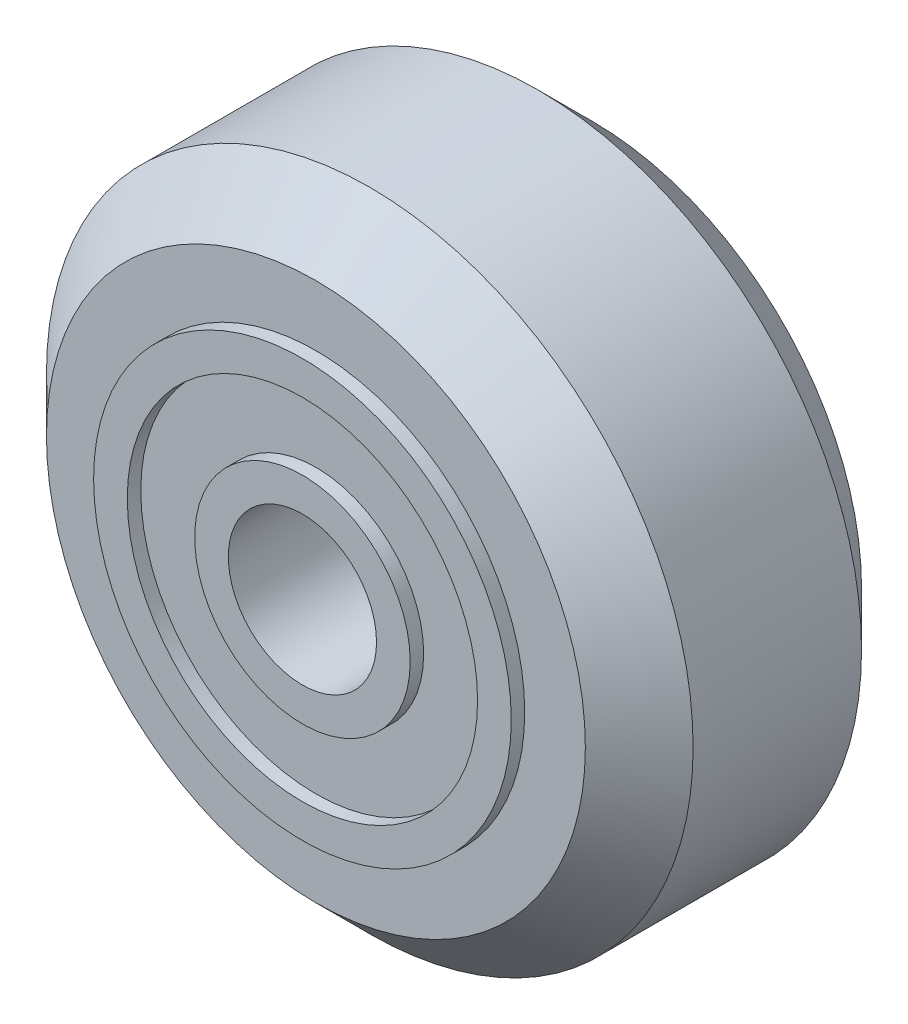
ISO-10303-21;
HEADER;
FILE_DESCRIPTION(('STEP AP214'),'2;1');
FILE_NAME('part.step','',(''),(''),'','','');
FILE_SCHEMA(('AUTOMOTIVE_DESIGN { 1 0 10303 214 1 1 1 1 }'));
ENDSEC;
DATA;
#1=APPLICATION_CONTEXT('core data for automotive mechanical design processes');
#2=APPLICATION_PROTOCOL_DEFINITION('international standard','automotive_design',2000,#1);
#3=PRODUCT_CONTEXT('',#1,'mechanical');
#4=PRODUCT('Part','Part','',(#3));
#5=PRODUCT_RELATED_PRODUCT_CATEGORY('part','',(#4));
#6=PRODUCT_DEFINITION_FORMATION('','',#4);
#7=PRODUCT_DEFINITION_CONTEXT('part definition',#1,'design');
#8=PRODUCT_DEFINITION('design','',#6,#7);
#9=PRODUCT_DEFINITION_SHAPE('','',#8);
#10=(LENGTH_UNIT() NAMED_UNIT(*) SI_UNIT(.MILLI.,.METRE.));
#11=(NAMED_UNIT(*) PLANE_ANGLE_UNIT() SI_UNIT($,.RADIAN.));
#12=(NAMED_UNIT(*) SI_UNIT($,.STERADIAN.) SOLID_ANGLE_UNIT());
#13=UNCERTAINTY_MEASURE_WITH_UNIT(LENGTH_MEASURE(1.E-05),#10,'distance_accuracy_value','');
#14=(GEOMETRIC_REPRESENTATION_CONTEXT(3) GLOBAL_UNCERTAINTY_ASSIGNED_CONTEXT((#13)) GLOBAL_UNIT_ASSIGNED_CONTEXT((#10,
#11,#12)) REPRESENTATION_CONTEXT('',''));
#15=CARTESIAN_POINT('',(0.,0.,0.));
#16=DIRECTION('',(0.,0.,1.));
#17=DIRECTION('',(1.,0.,0.));
#18=AXIS2_PLACEMENT_3D('',#15,#16,#17);
#19=CARTESIAN_POINT('',(0.,0.,-5.375));
#20=DIRECTION('',(0.,0.,1.));
#21=DIRECTION('',(1.,0.,0.));
#22=AXIS2_PLACEMENT_3D('',#19,#20,#21);
#23=CYLINDRICAL_SURFACE('',#22,6.5);
#24=CARTESIAN_POINT('',(0.,0.,-5.375));
#25=DIRECTION('',(0.,0.,1.));
#26=DIRECTION('',(1.,0.,0.));
#27=AXIS2_PLACEMENT_3D('',#24,#25,#26);
#28=CIRCLE('',#27,6.5);
#29=CARTESIAN_POINT('',(6.5,0.,-5.375));
#30=VERTEX_POINT('',#29);
#31=EDGE_CURVE('E79',#30,#30,#28,.T.);
#32=CARTESIAN_POINT('',(0.,0.,-5.125));
#33=DIRECTION('',(0.,0.,1.));
#34=DIRECTION('',(1.,0.,0.));
#35=AXIS2_PLACEMENT_3D('',#32,#33,#34);
#36=CIRCLE('',#35,6.5);
#37=CARTESIAN_POINT('',(6.5,0.,-5.125));
#38=VERTEX_POINT('',#37);
#39=EDGE_CURVE('E10',#38,#38,#36,.F.);
#40=CARTESIAN_POINT('',(6.5,0.,-5.375));
#41=CARTESIAN_POINT('',(6.5,0.,-5.37239583333333));
#42=CARTESIAN_POINT('',(6.5,0.,-5.36979166666667));
#43=CARTESIAN_POINT('',(6.5,0.,-5.36458333333333));
#44=CARTESIAN_POINT('',(6.5,0.,-5.36197916666667));
#45=CARTESIAN_POINT('',(6.5,0.,-5.35677083333333));
#46=CARTESIAN_POINT('',(6.5,0.,-5.35416666666667));
#47=CARTESIAN_POINT('',(6.5,0.,-5.34895833333333));
#48=CARTESIAN_POINT('',(6.5,0.,-5.34635416666667));
#49=CARTESIAN_POINT('',(6.5,0.,-5.34114583333333));
#50=CARTESIAN_POINT('',(6.5,0.,-5.33854166666667));
#51=CARTESIAN_POINT('',(6.5,0.,-5.33333333333333));
#52=CARTESIAN_POINT('',(6.5,0.,-5.33072916666667));
#53=CARTESIAN_POINT('',(6.5,0.,-5.32552083333333));
#54=CARTESIAN_POINT('',(6.5,0.,-5.32291666666667));
#55=CARTESIAN_POINT('',(6.5,0.,-5.31770833333333));
#56=CARTESIAN_POINT('',(6.5,0.,-5.31510416666667));
#57=CARTESIAN_POINT('',(6.5,0.,-5.30989583333333));
#58=CARTESIAN_POINT('',(6.5,0.,-5.30729166666667));
#59=CARTESIAN_POINT('',(6.5,0.,-5.30208333333333));
#60=CARTESIAN_POINT('',(6.5,0.,-5.29947916666667));
#61=CARTESIAN_POINT('',(6.5,0.,-5.29427083333333));
#62=CARTESIAN_POINT('',(6.5,0.,-5.29166666666667));
#63=CARTESIAN_POINT('',(6.5,0.,-5.28645833333333));
#64=CARTESIAN_POINT('',(6.5,0.,-5.28385416666667));
#65=CARTESIAN_POINT('',(6.5,0.,-5.27864583333333));
#66=CARTESIAN_POINT('',(6.5,0.,-5.27604166666667));
#67=CARTESIAN_POINT('',(6.5,0.,-5.27083333333333));
#68=CARTESIAN_POINT('',(6.5,0.,-5.26822916666667));
#69=CARTESIAN_POINT('',(6.5,0.,-5.26302083333333));
#70=CARTESIAN_POINT('',(6.5,0.,-5.26041666666667));
#71=CARTESIAN_POINT('',(6.5,0.,-5.25520833333333));
#72=CARTESIAN_POINT('',(6.5,0.,-5.25260416666667));
#73=CARTESIAN_POINT('',(6.5,0.,-5.24739583333333));
#74=CARTESIAN_POINT('',(6.5,0.,-5.24479166666667));
#75=CARTESIAN_POINT('',(6.5,0.,-5.23958333333333));
#76=CARTESIAN_POINT('',(6.5,0.,-5.23697916666667));
#77=CARTESIAN_POINT('',(6.5,0.,-5.23177083333333));
#78=CARTESIAN_POINT('',(6.5,0.,-5.22916666666667));
#79=CARTESIAN_POINT('',(6.5,0.,-5.22395833333333));
#80=CARTESIAN_POINT('',(6.5,0.,-5.22135416666667));
#81=CARTESIAN_POINT('',(6.5,0.,-5.21614583333333));
#82=CARTESIAN_POINT('',(6.5,0.,-5.21354166666667));
#83=CARTESIAN_POINT('',(6.5,0.,-5.20833333333333));
#84=CARTESIAN_POINT('',(6.5,0.,-5.20572916666667));
#85=CARTESIAN_POINT('',(6.5,0.,-5.20052083333333));
#86=CARTESIAN_POINT('',(6.5,0.,-5.19791666666667));
#87=CARTESIAN_POINT('',(6.5,0.,-5.19270833333333));
#88=CARTESIAN_POINT('',(6.5,0.,-5.19010416666667));
#89=CARTESIAN_POINT('',(6.5,0.,-5.18489583333333));
#90=CARTESIAN_POINT('',(6.5,0.,-5.18229166666667));
#91=CARTESIAN_POINT('',(6.5,0.,-5.17708333333333));
#92=CARTESIAN_POINT('',(6.5,0.,-5.17447916666667));
#93=CARTESIAN_POINT('',(6.5,0.,-5.16927083333333));
#94=CARTESIAN_POINT('',(6.5,0.,-5.16666666666667));
#95=CARTESIAN_POINT('',(6.5,0.,-5.16145833333333));
#96=CARTESIAN_POINT('',(6.5,0.,-5.15885416666667));
#97=CARTESIAN_POINT('',(6.5,0.,-5.15364583333333));
#98=CARTESIAN_POINT('',(6.5,0.,-5.15104166666667));
#99=CARTESIAN_POINT('',(6.5,0.,-5.14583333333333));
#100=CARTESIAN_POINT('',(6.5,0.,-5.14322916666667));
#101=CARTESIAN_POINT('',(6.5,0.,-5.13802083333333));
#102=CARTESIAN_POINT('',(6.5,0.,-5.13541666666667));
#103=CARTESIAN_POINT('',(6.5,0.,-5.13020833333333));
#104=CARTESIAN_POINT('',(6.5,0.,-5.12760416666667));
#105=CARTESIAN_POINT('',(6.5,0.,-5.125));
#106=B_SPLINE_CURVE_WITH_KNOTS('',3,(#40,#41,#42,#43,#44,#45,#46,#47,#48,#49,#50,#51,#52,#53,
#54,#55,#56,#57,#58,#59,#60,#61,#62,#63,#64,#65,#66,#67,#68,#69,#70,#71,#72,#73,#74,#75,#76,#77,
#78,#79,#80,#81,#82,#83,#84,#85,#86,#87,#88,#89,#90,#91,#92,#93,#94,#95,#96,#97,#98,#99,#100,
#101,#102,#103,#104,#105),.UNSPECIFIED.,.F.,.F.,(4,2,2,2,2,2,2,2,2,2,2,2,2,2,2,2,2,2,2,2,2,2,2,
2,2,2,2,2,2,2,2,2,4),(0.,0.00781250000000001,0.015625,0.0234375,0.03125,0.0390625,0.046875,
0.0546875,0.0625000000000001,0.0703125000000001,0.0781250000000001,0.0859375000000001,
0.0937500000000001,0.1015625,0.109375,0.1171875,0.125,0.1328125,0.140625,0.1484375,0.15625,
0.1640625,0.171875,0.1796875,0.1875,0.1953125,0.203125,0.2109375,0.21875,0.2265625,0.234375,
0.2421875,0.25),.UNSPECIFIED.);
#107=EDGE_CURVE('BSEAM43',#30,#38,#106,.T.);
#108=ORIENTED_EDGE('',*,*,#31,.F.);
#109=ORIENTED_EDGE('',*,*,#39,.F.);
#110=ORIENTED_EDGE('',*,*,#107,.T.);
#111=ORIENTED_EDGE('',*,*,#107,.F.);
#112=EDGE_LOOP('',(#108,#110,#109,#111));
#113=FACE_BOUND('',#112,.T.);
#114=ADVANCED_FACE('F43',(#113),#23,.F.);
#115=CARTESIAN_POINT('',(0.,0.,5.125));
#116=DIRECTION('',(0.,0.,1.));
#117=DIRECTION('',(1.,0.,0.));
#118=AXIS2_PLACEMENT_3D('',#115,#116,#117);
#119=PLANE('',#118);
#120=CARTESIAN_POINT('',(0.,0.,5.125));
#121=DIRECTION('',(0.,0.,1.));
#122=DIRECTION('',(1.,0.,0.));
#123=AXIS2_PLACEMENT_3D('',#120,#121,#122);
#124=CIRCLE('',#123,10.);
#125=CARTESIAN_POINT('',(10.,0.,5.125));
#126=VERTEX_POINT('',#125);
#127=EDGE_CURVE('E51',#126,#126,#124,.T.);
#128=ORIENTED_EDGE('',*,*,#127,.T.);
#129=EDGE_LOOP('',(#128));
#130=FACE_BOUND('',#129,.T.);
#131=CARTESIAN_POINT('',(0.,0.,5.125));
#132=DIRECTION('',(0.,0.,1.));
#133=DIRECTION('',(1.,0.,0.));
#134=AXIS2_PLACEMENT_3D('',#131,#132,#133);
#135=CIRCLE('',#134,7.75);
#136=CARTESIAN_POINT('',(7.75,0.,5.125));
#137=VERTEX_POINT('',#136);
#138=EDGE_CURVE('E66',#137,#137,#135,.T.);
#139=ORIENTED_EDGE('',*,*,#138,.F.);
#140=EDGE_LOOP('',(#139));
#141=FACE_BOUND('',#140,.T.);
#142=ADVANCED_FACE('F126',(#130,#141),#119,.T.);
#143=CARTESIAN_POINT('',(0.,0.,-5.125));
#144=DIRECTION('',(0.,0.,1.));
#145=DIRECTION('',(1.,0.,0.));
#146=AXIS2_PLACEMENT_3D('',#143,#144,#145);
#147=PLANE('',#146);
#148=CARTESIAN_POINT('',(0.,0.,-5.125));
#149=DIRECTION('',(0.,0.,1.));
#150=DIRECTION('',(1.,0.,0.));
#151=AXIS2_PLACEMENT_3D('',#148,#149,#150);
#152=CIRCLE('',#151,9.99999999999999);
#153=CARTESIAN_POINT('',(9.99999999999999,0.,-5.125));
#154=VERTEX_POINT('',#153);
#155=EDGE_CURVE('E54',#154,#154,#152,.F.);
#156=ORIENTED_EDGE('',*,*,#155,.T.);
#157=EDGE_LOOP('',(#156));
#158=FACE_BOUND('',#157,.T.);
#159=CARTESIAN_POINT('',(0.,0.,-5.125));
#160=DIRECTION('',(0.,0.,1.));
#161=DIRECTION('',(1.,0.,0.));
#162=AXIS2_PLACEMENT_3D('',#159,#160,#161);
#163=CIRCLE('',#162,7.75);
#164=CARTESIAN_POINT('',(7.75,0.,-5.125));
#165=VERTEX_POINT('',#164);
#166=EDGE_CURVE('E67',#165,#165,#163,.T.);
#167=ORIENTED_EDGE('',*,*,#166,.T.);
#168=EDGE_LOOP('',(#167));
#169=FACE_BOUND('',#168,.T.);
#170=ADVANCED_FACE('F132',(#158,#169),#147,.F.);
#171=CARTESIAN_POINT('',(0.,0.,5.125));
#172=DIRECTION('',(0.,0.,-1.));
#173=DIRECTION('',(-1.,0.,0.));
#174=AXIS2_PLACEMENT_3D('',#171,#172,#173);
#175=CYLINDRICAL_SURFACE('',#174,12.);
#176=CARTESIAN_POINT('',(0.,0.,-3.125));
#177=DIRECTION('',(0.,0.,1.));
#178=DIRECTION('',(1.,0.,0.));
#179=AXIS2_PLACEMENT_3D('',#176,#177,#178);
#180=CIRCLE('',#179,12.);
#181=CARTESIAN_POINT('',(12.,0.,-3.125));
#182=VERTEX_POINT('',#181);
#183=EDGE_CURVE('E56',#182,#182,#180,.T.);
#184=ORIENTED_EDGE('',*,*,#183,.T.);
#185=EDGE_LOOP('',(#184));
#186=FACE_BOUND('',#185,.T.);
#187=CARTESIAN_POINT('',(0.,0.,3.125));
#188=DIRECTION('',(0.,0.,1.));
#189=DIRECTION('',(1.,0.,0.));
#190=AXIS2_PLACEMENT_3D('',#187,#188,#189);
#191=CIRCLE('',#190,12.);
#192=CARTESIAN_POINT('',(12.,0.,3.125));
#193=VERTEX_POINT('',#192);
#194=EDGE_CURVE('E63',#193,#193,#191,.F.);
#195=ORIENTED_EDGE('',*,*,#194,.T.);
#196=EDGE_LOOP('',(#195));
#197=FACE_BOUND('',#196,.T.);
#198=ADVANCED_FACE('F167',(#186,#197),#175,.T.);
#199=CARTESIAN_POINT('',(0.,0.,-3.125));
#200=DIRECTION('',(0.,0.,1.));
#201=DIRECTION('',(1.,0.,0.));
#202=AXIS2_PLACEMENT_3D('',#199,#200,#201);
#203=CONICAL_SURFACE('',#202,12.,0.78539816339745);
#204=ORIENTED_EDGE('',*,*,#155,.F.);
#205=EDGE_LOOP('',(#204));
#206=FACE_BOUND('',#205,.T.);
#207=ORIENTED_EDGE('',*,*,#183,.F.);
#208=EDGE_LOOP('',(#207));
#209=FACE_BOUND('',#208,.T.);
#210=ADVANCED_FACE('F166',(#206,#209),#203,.T.);
#211=CARTESIAN_POINT('',(0.,0.,5.125));
#212=DIRECTION('',(0.,0.,-1.));
#213=DIRECTION('',(-1.,0.,0.));
#214=AXIS2_PLACEMENT_3D('',#211,#212,#213);
#215=CONICAL_SURFACE('',#214,10.,0.785398163397446);
#216=ORIENTED_EDGE('',*,*,#194,.F.);
#217=EDGE_LOOP('',(#216));
#218=FACE_BOUND('',#217,.T.);
#219=ORIENTED_EDGE('',*,*,#127,.F.);
#220=EDGE_LOOP('',(#219));
#221=FACE_BOUND('',#220,.T.);
#222=ADVANCED_FACE('F46',(#218,#221),#215,.T.);
#223=CARTESIAN_POINT('',(0.,0.,-5.375));
#224=DIRECTION('',(0.,0.,1.));
#225=DIRECTION('',(1.,0.,0.));
#226=AXIS2_PLACEMENT_3D('',#223,#224,#225);
#227=CYLINDRICAL_SURFACE('',#226,7.75);
#228=CARTESIAN_POINT('',(0.,0.,-5.375));
#229=DIRECTION('',(0.,0.,1.));
#230=DIRECTION('',(1.,0.,0.));
#231=AXIS2_PLACEMENT_3D('',#228,#229,#230);
#232=CIRCLE('',#231,7.75);
#233=CARTESIAN_POINT('',(7.75,0.,-5.375));
#234=VERTEX_POINT('',#233);
#235=EDGE_CURVE('E71',#234,#234,#232,.T.);
#236=CARTESIAN_POINT('',(7.75,0.,-5.375));
#237=CARTESIAN_POINT('',(7.75,0.,-5.37239583333333));
#238=CARTESIAN_POINT('',(7.75,0.,-5.36979166666667));
#239=CARTESIAN_POINT('',(7.75,0.,-5.36458333333333));
#240=CARTESIAN_POINT('',(7.75,0.,-5.36197916666667));
#241=CARTESIAN_POINT('',(7.75,0.,-5.35677083333333));
#242=CARTESIAN_POINT('',(7.75,0.,-5.35416666666667));
#243=CARTESIAN_POINT('',(7.75,0.,-5.34895833333333));
#244=CARTESIAN_POINT('',(7.75,0.,-5.34635416666667));
#245=CARTESIAN_POINT('',(7.75,0.,-5.34114583333333));
#246=CARTESIAN_POINT('',(7.75,0.,-5.33854166666667));
#247=CARTESIAN_POINT('',(7.75,0.,-5.33333333333333));
#248=CARTESIAN_POINT('',(7.75,0.,-5.33072916666667));
#249=CARTESIAN_POINT('',(7.75,0.,-5.32552083333333));
#250=CARTESIAN_POINT('',(7.75,0.,-5.32291666666667));
#251=CARTESIAN_POINT('',(7.75,0.,-5.31770833333333));
#252=CARTESIAN_POINT('',(7.75,0.,-5.31510416666667));
#253=CARTESIAN_POINT('',(7.75,0.,-5.30989583333333));
#254=CARTESIAN_POINT('',(7.75,0.,-5.30729166666667));
#255=CARTESIAN_POINT('',(7.75,0.,-5.30208333333333));
#256=CARTESIAN_POINT('',(7.75,0.,-5.29947916666667));
#257=CARTESIAN_POINT('',(7.75,0.,-5.29427083333333));
#258=CARTESIAN_POINT('',(7.75,0.,-5.29166666666667));
#259=CARTESIAN_POINT('',(7.75,0.,-5.28645833333333));
#260=CARTESIAN_POINT('',(7.75,0.,-5.28385416666667));
#261=CARTESIAN_POINT('',(7.75,0.,-5.27864583333333));
#262=CARTESIAN_POINT('',(7.75,0.,-5.27604166666667));
#263=CARTESIAN_POINT('',(7.75,0.,-5.27083333333333));
#264=CARTESIAN_POINT('',(7.75,0.,-5.26822916666667));
#265=CARTESIAN_POINT('',(7.75,0.,-5.26302083333333));
#266=CARTESIAN_POINT('',(7.75,0.,-5.26041666666667));
#267=CARTESIAN_POINT('',(7.75,0.,-5.25520833333333));
#268=CARTESIAN_POINT('',(7.75,0.,-5.25260416666667));
#269=CARTESIAN_POINT('',(7.75,0.,-5.24739583333333));
#270=CARTESIAN_POINT('',(7.75,0.,-5.24479166666667));
#271=CARTESIAN_POINT('',(7.75,0.,-5.23958333333333));
#272=CARTESIAN_POINT('',(7.75,0.,-5.23697916666667));
#273=CARTESIAN_POINT('',(7.75,0.,-5.23177083333333));
#274=CARTESIAN_POINT('',(7.75,0.,-5.22916666666667));
#275=CARTESIAN_POINT('',(7.75,0.,-5.22395833333333));
#276=CARTESIAN_POINT('',(7.75,0.,-5.22135416666667));
#277=CARTESIAN_POINT('',(7.75,0.,-5.21614583333333));
#278=CARTESIAN_POINT('',(7.75,0.,-5.21354166666667));
#279=CARTESIAN_POINT('',(7.75,0.,-5.20833333333333));
#280=CARTESIAN_POINT('',(7.75,0.,-5.20572916666667));
#281=CARTESIAN_POINT('',(7.75,0.,-5.20052083333333));
#282=CARTESIAN_POINT('',(7.75,0.,-5.19791666666667));
#283=CARTESIAN_POINT('',(7.75,0.,-5.19270833333333));
#284=CARTESIAN_POINT('',(7.75,0.,-5.19010416666667));
#285=CARTESIAN_POINT('',(7.75,0.,-5.18489583333333));
#286=CARTESIAN_POINT('',(7.75,0.,-5.18229166666667));
#287=CARTESIAN_POINT('',(7.75,0.,-5.17708333333333));
#288=CARTESIAN_POINT('',(7.75,0.,-5.17447916666667));
#289=CARTESIAN_POINT('',(7.75,0.,-5.16927083333333));
#290=CARTESIAN_POINT('',(7.75,0.,-5.16666666666667));
#291=CARTESIAN_POINT('',(7.75,0.,-5.16145833333333));
#292=CARTESIAN_POINT('',(7.75,0.,-5.15885416666667));
#293=CARTESIAN_POINT('',(7.75,0.,-5.15364583333333));
#294=CARTESIAN_POINT('',(7.75,0.,-5.15104166666667));
#295=CARTESIAN_POINT('',(7.75,0.,-5.14583333333333));
#296=CARTESIAN_POINT('',(7.75,0.,-5.14322916666667));
#297=CARTESIAN_POINT('',(7.75,0.,-5.13802083333333));
#298=CARTESIAN_POINT('',(7.75,0.,-5.13541666666667));
#299=CARTESIAN_POINT('',(7.75,0.,-5.13020833333333));
#300=CARTESIAN_POINT('',(7.75,0.,-5.12760416666667));
#301=CARTESIAN_POINT('',(7.75,0.,-5.125));
#302=B_SPLINE_CURVE_WITH_KNOTS('',3,(#236,#237,#238,#239,#240,#241,#242,#243,#244,#245,#246,
#247,#248,#249,#250,#251,#252,#253,#254,#255,#256,#257,#258,#259,#260,#261,#262,#263,#264,#265,
#266,#267,#268,#269,#270,#271,#272,#273,#274,#275,#276,#277,#278,#279,#280,#281,#282,#283,#284,
#285,#286,#287,#288,#289,#290,#291,#292,#293,#294,#295,#296,#297,#298,#299,#300,#301),
.UNSPECIFIED.,.F.,.F.,(4,2,2,2,2,2,2,2,2,2,2,2,2,2,2,2,2,2,2,2,2,2,2,2,2,2,2,2,2,2,2,2,4),(0.,
0.00781250000000087,0.0156250000000009,0.0234375000000009,0.0312500000000009,0.0390625000000009,
0.0468750000000009,0.0546875000000009,0.0625000000000009,0.0703125000000009,0.0781250000000009,
0.0859375000000009,0.0937500000000009,0.101562500000001,0.109375000000001,0.117187500000001,
0.125000000000001,0.132812500000001,0.140625000000001,0.148437500000001,0.156250000000001,
0.164062500000001,0.171875000000001,0.179687500000001,0.187500000000001,0.195312500000001,
0.203125000000001,0.210937500000001,0.218750000000001,0.226562500000001,0.234375000000001,
0.242187500000001,0.250000000000001),.UNSPECIFIED.);
#303=EDGE_CURVE('BSEAM157',#234,#165,#302,.T.);
#304=ORIENTED_EDGE('',*,*,#235,.T.);
#305=ORIENTED_EDGE('',*,*,#166,.F.);
#306=ORIENTED_EDGE('',*,*,#303,.T.);
#307=ORIENTED_EDGE('',*,*,#303,.F.);
#308=EDGE_LOOP('',(#304,#306,#305,#307));
#309=FACE_BOUND('',#308,.T.);
#310=ADVANCED_FACE('F157',(#309),#227,.T.);
#311=CARTESIAN_POINT('',(0.,0.,5.625));
#312=DIRECTION('',(0.,0.,1.));
#313=DIRECTION('',(1.,0.,0.));
#314=AXIS2_PLACEMENT_3D('',#311,#312,#313);
#315=CIRCLE('',#314,7.75);
#316=CARTESIAN_POINT('',(7.75,0.,5.625));
#317=VERTEX_POINT('',#316);
#318=EDGE_CURVE('E78',#317,#317,#315,.T.);
#319=CARTESIAN_POINT('',(7.75,0.,5.125));
#320=CARTESIAN_POINT('',(7.75,0.,5.13020833333333));
#321=CARTESIAN_POINT('',(7.75,0.,5.13541666666667));
#322=CARTESIAN_POINT('',(7.75,0.,5.14583333333333));
#323=CARTESIAN_POINT('',(7.75,0.,5.15104166666667));
#324=CARTESIAN_POINT('',(7.75,0.,5.16145833333333));
#325=CARTESIAN_POINT('',(7.75,0.,5.16666666666667));
#326=CARTESIAN_POINT('',(7.75,0.,5.17708333333333));
#327=CARTESIAN_POINT('',(7.75,0.,5.18229166666667));
#328=CARTESIAN_POINT('',(7.75,0.,5.19270833333333));
#329=CARTESIAN_POINT('',(7.75,0.,5.19791666666667));
#330=CARTESIAN_POINT('',(7.75,0.,5.20833333333333));
#331=CARTESIAN_POINT('',(7.75,0.,5.21354166666667));
#332=CARTESIAN_POINT('',(7.75,0.,5.22395833333333));
#333=CARTESIAN_POINT('',(7.75,0.,5.22916666666667));
#334=CARTESIAN_POINT('',(7.75,0.,5.23958333333333));
#335=CARTESIAN_POINT('',(7.75,0.,5.24479166666667));
#336=CARTESIAN_POINT('',(7.75,0.,5.25520833333333));
#337=CARTESIAN_POINT('',(7.75,0.,5.26041666666667));
#338=CARTESIAN_POINT('',(7.75,0.,5.27083333333333));
#339=CARTESIAN_POINT('',(7.75,0.,5.27604166666667));
#340=CARTESIAN_POINT('',(7.75,0.,5.28645833333333));
#341=CARTESIAN_POINT('',(7.75,0.,5.29166666666667));
#342=CARTESIAN_POINT('',(7.75,0.,5.30208333333333));
#343=CARTESIAN_POINT('',(7.75,0.,5.30729166666667));
#344=CARTESIAN_POINT('',(7.75,0.,5.31770833333333));
#345=CARTESIAN_POINT('',(7.75,0.,5.32291666666667));
#346=CARTESIAN_POINT('',(7.75,0.,5.33333333333333));
#347=CARTESIAN_POINT('',(7.75,0.,5.33854166666667));
#348=CARTESIAN_POINT('',(7.75,0.,5.34895833333333));
#349=CARTESIAN_POINT('',(7.75,0.,5.35416666666667));
#350=CARTESIAN_POINT('',(7.75,0.,5.36458333333333));
#351=CARTESIAN_POINT('',(7.75,0.,5.36979166666667));
#352=CARTESIAN_POINT('',(7.75,0.,5.38020833333333));
#353=CARTESIAN_POINT('',(7.75,0.,5.38541666666667));
#354=CARTESIAN_POINT('',(7.75,0.,5.39583333333333));
#355=CARTESIAN_POINT('',(7.75,0.,5.40104166666667));
#356=CARTESIAN_POINT('',(7.75,0.,5.41145833333333));
#357=CARTESIAN_POINT('',(7.75,0.,5.41666666666667));
#358=CARTESIAN_POINT('',(7.75,0.,5.42708333333333));
#359=CARTESIAN_POINT('',(7.75,0.,5.43229166666667));
#360=CARTESIAN_POINT('',(7.75,0.,5.44270833333333));
#361=CARTESIAN_POINT('',(7.75,0.,5.44791666666667));
#362=CARTESIAN_POINT('',(7.75,0.,5.45833333333333));
#363=CARTESIAN_POINT('',(7.75,0.,5.46354166666667));
#364=CARTESIAN_POINT('',(7.75,0.,5.47395833333333));
#365=CARTESIAN_POINT('',(7.75,0.,5.47916666666667));
#366=CARTESIAN_POINT('',(7.75,0.,5.48958333333333));
#367=CARTESIAN_POINT('',(7.75,0.,5.49479166666667));
#368=CARTESIAN_POINT('',(7.75,0.,5.50520833333333));
#369=CARTESIAN_POINT('',(7.75,0.,5.51041666666667));
#370=CARTESIAN_POINT('',(7.75,0.,5.52083333333333));
#371=CARTESIAN_POINT('',(7.75,0.,5.52604166666667));
#372=CARTESIAN_POINT('',(7.75,0.,5.53645833333333));
#373=CARTESIAN_POINT('',(7.75,0.,5.54166666666667));
#374=CARTESIAN_POINT('',(7.75,0.,5.55208333333333));
#375=CARTESIAN_POINT('',(7.75,0.,5.55729166666667));
#376=CARTESIAN_POINT('',(7.75,0.,5.56770833333333));
#377=CARTESIAN_POINT('',(7.75,0.,5.57291666666667));
#378=CARTESIAN_POINT('',(7.75,0.,5.58333333333333));
#379=CARTESIAN_POINT('',(7.75,0.,5.58854166666667));
#380=CARTESIAN_POINT('',(7.75,0.,5.59895833333333));
#381=CARTESIAN_POINT('',(7.75,0.,5.60416666666667));
#382=CARTESIAN_POINT('',(7.75,0.,5.61458333333333));
#383=CARTESIAN_POINT('',(7.75,0.,5.61979166666667));
#384=CARTESIAN_POINT('',(7.75,0.,5.625));
#385=B_SPLINE_CURVE_WITH_KNOTS('',3,(#319,#320,#321,#322,#323,#324,#325,#326,#327,#328,#329,
#330,#331,#332,#333,#334,#335,#336,#337,#338,#339,#340,#341,#342,#343,#344,#345,#346,#347,#348,
#349,#350,#351,#352,#353,#354,#355,#356,#357,#358,#359,#360,#361,#362,#363,#364,#365,#366,#367,
#368,#369,#370,#371,#372,#373,#374,#375,#376,#377,#378,#379,#380,#381,#382,#383,#384),
.UNSPECIFIED.,.F.,.F.,(4,2,2,2,2,2,2,2,2,2,2,2,2,2,2,2,2,2,2,2,2,2,2,2,2,2,2,2,2,2,2,2,4),(0.,
0.015625,0.03125,0.046875,0.0625000000000001,0.0781250000000001,0.0937500000000001,0.109375,
0.125,0.140625,0.15625,0.171875,0.1875,0.203125,0.21875,0.234375,0.25,0.265625,0.28125,0.296875,
0.3125,0.328125,0.34375,0.359375,0.375,0.390625,0.40625,0.421875,0.4375,0.453125,0.46875,
0.484375,0.5),.UNSPECIFIED.);
#386=EDGE_CURVE('BSEAM149',#137,#317,#385,.T.);
#387=ORIENTED_EDGE('',*,*,#138,.T.);
#388=ORIENTED_EDGE('',*,*,#318,.F.);
#389=ORIENTED_EDGE('',*,*,#386,.T.);
#390=ORIENTED_EDGE('',*,*,#386,.F.);
#391=EDGE_LOOP('',(#387,#389,#388,#390));
#392=FACE_BOUND('',#391,.T.);
#393=ADVANCED_FACE('F149',(#392),#227,.T.);
#394=CARTESIAN_POINT('',(0.,0.,-5.375));
#395=DIRECTION('',(0.,0.,1.));
#396=DIRECTION('',(1.,0.,0.));
#397=AXIS2_PLACEMENT_3D('',#394,#395,#396);
#398=PLANE('',#397);
#399=ORIENTED_EDGE('',*,*,#31,.T.);
#400=EDGE_LOOP('',(#399));
#401=FACE_BOUND('',#400,.T.);
#402=ORIENTED_EDGE('',*,*,#235,.F.);
#403=EDGE_LOOP('',(#402));
#404=FACE_BOUND('',#403,.T.);
#405=ADVANCED_FACE('F142',(#401,#404),#398,.F.);
#406=CARTESIAN_POINT('',(0.,0.,5.125));
#407=DIRECTION('',(0.,0.,1.));
#408=DIRECTION('',(1.,0.,0.));
#409=AXIS2_PLACEMENT_3D('',#406,#407,#408);
#410=CIRCLE('',#409,6.5);
#411=CARTESIAN_POINT('',(6.5,0.,5.125));
#412=VERTEX_POINT('',#411);
#413=EDGE_CURVE('E86',#412,#412,#410,.T.);
#414=CARTESIAN_POINT('',(0.,0.,5.625));
#415=DIRECTION('',(0.,0.,1.));
#416=DIRECTION('',(1.,0.,0.));
#417=AXIS2_PLACEMENT_3D('',#414,#415,#416);
#418=CIRCLE('',#417,6.5);
#419=CARTESIAN_POINT('',(6.5,0.,5.625));
#420=VERTEX_POINT('',#419);
#421=EDGE_CURVE('E81',#420,#420,#418,.T.);
#422=CARTESIAN_POINT('',(6.5,0.,5.125));
#423=CARTESIAN_POINT('',(6.5,0.,5.13020833333333));
#424=CARTESIAN_POINT('',(6.5,0.,5.13541666666667));
#425=CARTESIAN_POINT('',(6.5,0.,5.14583333333333));
#426=CARTESIAN_POINT('',(6.5,0.,5.15104166666667));
#427=CARTESIAN_POINT('',(6.5,0.,5.16145833333333));
#428=CARTESIAN_POINT('',(6.5,0.,5.16666666666667));
#429=CARTESIAN_POINT('',(6.5,0.,5.17708333333333));
#430=CARTESIAN_POINT('',(6.5,0.,5.18229166666667));
#431=CARTESIAN_POINT('',(6.5,0.,5.19270833333333));
#432=CARTESIAN_POINT('',(6.5,0.,5.19791666666667));
#433=CARTESIAN_POINT('',(6.5,0.,5.20833333333333));
#434=CARTESIAN_POINT('',(6.5,0.,5.21354166666667));
#435=CARTESIAN_POINT('',(6.5,0.,5.22395833333333));
#436=CARTESIAN_POINT('',(6.5,0.,5.22916666666667));
#437=CARTESIAN_POINT('',(6.5,0.,5.23958333333333));
#438=CARTESIAN_POINT('',(6.5,0.,5.24479166666667));
#439=CARTESIAN_POINT('',(6.5,0.,5.25520833333333));
#440=CARTESIAN_POINT('',(6.5,0.,5.26041666666667));
#441=CARTESIAN_POINT('',(6.5,0.,5.27083333333333));
#442=CARTESIAN_POINT('',(6.5,0.,5.27604166666667));
#443=CARTESIAN_POINT('',(6.5,0.,5.28645833333333));
#444=CARTESIAN_POINT('',(6.5,0.,5.29166666666667));
#445=CARTESIAN_POINT('',(6.5,0.,5.30208333333333));
#446=CARTESIAN_POINT('',(6.5,0.,5.30729166666667));
#447=CARTESIAN_POINT('',(6.5,0.,5.31770833333333));
#448=CARTESIAN_POINT('',(6.5,0.,5.32291666666667));
#449=CARTESIAN_POINT('',(6.5,0.,5.33333333333333));
#450=CARTESIAN_POINT('',(6.5,0.,5.33854166666667));
#451=CARTESIAN_POINT('',(6.5,0.,5.34895833333333));
#452=CARTESIAN_POINT('',(6.5,0.,5.35416666666667));
#453=CARTESIAN_POINT('',(6.5,0.,5.36458333333333));
#454=CARTESIAN_POINT('',(6.5,0.,5.36979166666667));
#455=CARTESIAN_POINT('',(6.5,0.,5.38020833333333));
#456=CARTESIAN_POINT('',(6.5,0.,5.38541666666667));
#457=CARTESIAN_POINT('',(6.5,0.,5.39583333333333));
#458=CARTESIAN_POINT('',(6.5,0.,5.40104166666667));
#459=CARTESIAN_POINT('',(6.5,0.,5.41145833333333));
#460=CARTESIAN_POINT('',(6.5,0.,5.41666666666667));
#461=CARTESIAN_POINT('',(6.5,0.,5.42708333333333));
#462=CARTESIAN_POINT('',(6.5,0.,5.43229166666667));
#463=CARTESIAN_POINT('',(6.5,0.,5.44270833333333));
#464=CARTESIAN_POINT('',(6.5,0.,5.44791666666667));
#465=CARTESIAN_POINT('',(6.5,0.,5.45833333333333));
#466=CARTESIAN_POINT('',(6.5,0.,5.46354166666667));
#467=CARTESIAN_POINT('',(6.5,0.,5.47395833333333));
#468=CARTESIAN_POINT('',(6.5,0.,5.47916666666667));
#469=CARTESIAN_POINT('',(6.5,0.,5.48958333333333));
#470=CARTESIAN_POINT('',(6.5,0.,5.49479166666667));
#471=CARTESIAN_POINT('',(6.5,0.,5.50520833333333));
#472=CARTESIAN_POINT('',(6.5,0.,5.51041666666667));
#473=CARTESIAN_POINT('',(6.5,0.,5.52083333333333));
#474=CARTESIAN_POINT('',(6.5,0.,5.52604166666667));
#475=CARTESIAN_POINT('',(6.5,0.,5.53645833333333));
#476=CARTESIAN_POINT('',(6.5,0.,5.54166666666667));
#477=CARTESIAN_POINT('',(6.5,0.,5.55208333333333));
#478=CARTESIAN_POINT('',(6.5,0.,5.55729166666667));
#479=CARTESIAN_POINT('',(6.5,0.,5.56770833333333));
#480=CARTESIAN_POINT('',(6.5,0.,5.57291666666667));
#481=CARTESIAN_POINT('',(6.5,0.,5.58333333333333));
#482=CARTESIAN_POINT('',(6.5,0.,5.58854166666667));
#483=CARTESIAN_POINT('',(6.5,0.,5.59895833333333));
#484=CARTESIAN_POINT('',(6.5,0.,5.60416666666667));
#485=CARTESIAN_POINT('',(6.5,0.,5.61458333333333));
#486=CARTESIAN_POINT('',(6.5,0.,5.61979166666667));
#487=CARTESIAN_POINT('',(6.5,0.,5.625));
#488=B_SPLINE_CURVE_WITH_KNOTS('',3,(#422,#423,#424,#425,#426,#427,#428,#429,#430,#431,#432,
#433,#434,#435,#436,#437,#438,#439,#440,#441,#442,#443,#444,#445,#446,#447,#448,#449,#450,#451,
#452,#453,#454,#455,#456,#457,#458,#459,#460,#461,#462,#463,#464,#465,#466,#467,#468,#469,#470,
#471,#472,#473,#474,#475,#476,#477,#478,#479,#480,#481,#482,#483,#484,#485,#486,#487),
.UNSPECIFIED.,.F.,.F.,(4,2,2,2,2,2,2,2,2,2,2,2,2,2,2,2,2,2,2,2,2,2,2,2,2,2,2,2,2,2,2,2,4),(0.,
0.015625,0.03125,0.046875,0.0625000000000001,0.0781250000000001,0.0937500000000001,0.109375,
0.125,0.140625,0.15625,0.171875,0.1875,0.203125,0.21875,0.234375,0.25,0.265625,0.28125,0.296875,
0.3125,0.328125,0.34375,0.359375,0.375,0.390625,0.40625,0.421875,0.4375,0.453125,0.46875,
0.484375,0.5),.UNSPECIFIED.);
#489=EDGE_CURVE('BSEAM134',#412,#420,#488,.T.);
#490=ORIENTED_EDGE('',*,*,#413,.F.);
#491=ORIENTED_EDGE('',*,*,#421,.T.);
#492=ORIENTED_EDGE('',*,*,#489,.T.);
#493=ORIENTED_EDGE('',*,*,#489,.F.);
#494=EDGE_LOOP('',(#490,#492,#491,#493));
#495=FACE_BOUND('',#494,.T.);
#496=ADVANCED_FACE('F134',(#495),#23,.F.);
#497=CARTESIAN_POINT('',(0.,0.,5.625));
#498=DIRECTION('',(0.,0.,1.));
#499=DIRECTION('',(1.,0.,0.));
#500=AXIS2_PLACEMENT_3D('',#497,#498,#499);
#501=PLANE('',#500);
#502=ORIENTED_EDGE('',*,*,#318,.T.);
#503=EDGE_LOOP('',(#502));
#504=FACE_BOUND('',#503,.T.);
#505=ORIENTED_EDGE('',*,*,#421,.F.);
#506=EDGE_LOOP('',(#505));
#507=FACE_BOUND('',#506,.T.);
#508=ADVANCED_FACE('F123',(#504,#507),#501,.T.);
#509=CARTESIAN_POINT('',(0.,0.,5.125));
#510=DIRECTION('',(0.,0.,1.));
#511=DIRECTION('',(1.,0.,0.));
#512=AXIS2_PLACEMENT_3D('',#509,#510,#511);
#513=PLANE('',#512);
#514=CARTESIAN_POINT('',(0.,0.,5.125));
#515=DIRECTION('',(0.,0.,1.));
#516=DIRECTION('',(1.,0.,0.));
#517=AXIS2_PLACEMENT_3D('',#514,#515,#516);
#518=CIRCLE('',#517,4.);
#519=CARTESIAN_POINT('',(4.,0.,5.125));
#520=VERTEX_POINT('',#519);
#521=EDGE_CURVE('E93',#520,#520,#518,.T.);
#522=ORIENTED_EDGE('',*,*,#521,.F.);
#523=EDGE_LOOP('',(#522));
#524=FACE_BOUND('',#523,.T.);
#525=ORIENTED_EDGE('',*,*,#413,.T.);
#526=EDGE_LOOP('',(#525));
#527=FACE_BOUND('',#526,.T.);
#528=ADVANCED_FACE('F118',(#524,#527),#513,.T.);
#529=CARTESIAN_POINT('',(0.,0.,-5.125));
#530=DIRECTION('',(0.,0.,1.));
#531=DIRECTION('',(1.,0.,0.));
#532=AXIS2_PLACEMENT_3D('',#529,#530,#531);
#533=PLANE('',#532);
#534=ORIENTED_EDGE('',*,*,#39,.T.);
#535=EDGE_LOOP('',(#534));
#536=FACE_BOUND('',#535,.T.);
#537=CARTESIAN_POINT('',(0.,0.,-5.125));
#538=DIRECTION('',(0.,0.,1.));
#539=DIRECTION('',(1.,0.,0.));
#540=AXIS2_PLACEMENT_3D('',#537,#538,#539);
#541=CIRCLE('',#540,4.);
#542=CARTESIAN_POINT('',(4.,0.,-5.125));
#543=VERTEX_POINT('',#542);
#544=EDGE_CURVE('E82',#543,#543,#541,.F.);
#545=ORIENTED_EDGE('',*,*,#544,.F.);
#546=EDGE_LOOP('',(#545));
#547=FACE_BOUND('',#546,.T.);
#548=ADVANCED_FACE('F111',(#536,#547),#533,.F.);
#549=CARTESIAN_POINT('',(0.,0.,-16.6887084989848));
#550=DIRECTION('',(0.,0.,1.));
#551=DIRECTION('',(1.,0.,0.));
#552=AXIS2_PLACEMENT_3D('',#549,#550,#551);
#553=CYLINDRICAL_SURFACE('',#552,4.);
#554=CARTESIAN_POINT('',(0.,0.,-5.375));
#555=DIRECTION('',(0.,0.,1.));
#556=DIRECTION('',(1.,0.,0.));
#557=AXIS2_PLACEMENT_3D('',#554,#555,#556);
#558=CIRCLE('',#557,4.);
#559=CARTESIAN_POINT('',(4.,0.,-5.375));
#560=VERTEX_POINT('',#559);
#561=EDGE_CURVE('E94',#560,#560,#558,.F.);
#562=CARTESIAN_POINT('',(4.,0.,-5.375));
#563=CARTESIAN_POINT('',(4.,0.,-5.37239583333334));
#564=CARTESIAN_POINT('',(4.,0.,-5.36979166666667));
#565=CARTESIAN_POINT('',(4.,0.,-5.36458333333334));
#566=CARTESIAN_POINT('',(4.,0.,-5.36197916666667));
#567=CARTESIAN_POINT('',(4.,0.,-5.35677083333334));
#568=CARTESIAN_POINT('',(4.,0.,-5.35416666666667));
#569=CARTESIAN_POINT('',(4.,0.,-5.34895833333334));
#570=CARTESIAN_POINT('',(4.,0.,-5.34635416666667));
#571=CARTESIAN_POINT('',(4.,0.,-5.34114583333334));
#572=CARTESIAN_POINT('',(4.,0.,-5.33854166666667));
#573=CARTESIAN_POINT('',(4.,0.,-5.33333333333334));
#574=CARTESIAN_POINT('',(4.,0.,-5.33072916666667));
#575=CARTESIAN_POINT('',(4.,0.,-5.32552083333334));
#576=CARTESIAN_POINT('',(4.,0.,-5.32291666666667));
#577=CARTESIAN_POINT('',(4.,0.,-5.31770833333334));
#578=CARTESIAN_POINT('',(4.,0.,-5.31510416666667));
#579=CARTESIAN_POINT('',(4.,0.,-5.30989583333334));
#580=CARTESIAN_POINT('',(4.,0.,-5.30729166666667));
#581=CARTESIAN_POINT('',(4.,0.,-5.30208333333334));
#582=CARTESIAN_POINT('',(4.,0.,-5.29947916666667));
#583=CARTESIAN_POINT('',(4.,0.,-5.29427083333334));
#584=CARTESIAN_POINT('',(4.,0.,-5.29166666666667));
#585=CARTESIAN_POINT('',(4.,0.,-5.28645833333334));
#586=CARTESIAN_POINT('',(4.,0.,-5.28385416666667));
#587=CARTESIAN_POINT('',(4.,0.,-5.27864583333334));
#588=CARTESIAN_POINT('',(4.,0.,-5.27604166666667));
#589=CARTESIAN_POINT('',(4.,0.,-5.27083333333334));
#590=CARTESIAN_POINT('',(4.,0.,-5.26822916666667));
#591=CARTESIAN_POINT('',(4.,0.,-5.26302083333334));
#592=CARTESIAN_POINT('',(4.,0.,-5.26041666666667));
#593=CARTESIAN_POINT('',(4.,0.,-5.25520833333334));
#594=CARTESIAN_POINT('',(4.,0.,-5.25260416666667));
#595=CARTESIAN_POINT('',(4.,0.,-5.24739583333334));
#596=CARTESIAN_POINT('',(4.,0.,-5.24479166666667));
#597=CARTESIAN_POINT('',(4.,0.,-5.23958333333334));
#598=CARTESIAN_POINT('',(4.,0.,-5.23697916666667));
#599=CARTESIAN_POINT('',(4.,0.,-5.23177083333334));
#600=CARTESIAN_POINT('',(4.,0.,-5.22916666666667));
#601=CARTESIAN_POINT('',(4.,0.,-5.22395833333334));
#602=CARTESIAN_POINT('',(4.,0.,-5.22135416666667));
#603=CARTESIAN_POINT('',(4.,0.,-5.21614583333334));
#604=CARTESIAN_POINT('',(4.,0.,-5.21354166666667));
#605=CARTESIAN_POINT('',(4.,0.,-5.20833333333334));
#606=CARTESIAN_POINT('',(4.,0.,-5.20572916666667));
#607=CARTESIAN_POINT('',(4.,0.,-5.20052083333334));
#608=CARTESIAN_POINT('',(4.,0.,-5.19791666666667));
#609=CARTESIAN_POINT('',(4.,0.,-5.19270833333334));
#610=CARTESIAN_POINT('',(4.,0.,-5.19010416666667));
#611=CARTESIAN_POINT('',(4.,0.,-5.18489583333334));
#612=CARTESIAN_POINT('',(4.,0.,-5.18229166666667));
#613=CARTESIAN_POINT('',(4.,0.,-5.17708333333334));
#614=CARTESIAN_POINT('',(4.,0.,-5.17447916666667));
#615=CARTESIAN_POINT('',(4.,0.,-5.16927083333334));
#616=CARTESIAN_POINT('',(4.,0.,-5.16666666666667));
#617=CARTESIAN_POINT('',(4.,0.,-5.16145833333334));
#618=CARTESIAN_POINT('',(4.,0.,-5.15885416666667));
#619=CARTESIAN_POINT('',(4.,0.,-5.15364583333334));
#620=CARTESIAN_POINT('',(4.,0.,-5.15104166666667));
#621=CARTESIAN_POINT('',(4.,0.,-5.14583333333334));
#622=CARTESIAN_POINT('',(4.,0.,-5.14322916666667));
#623=CARTESIAN_POINT('',(4.,0.,-5.13802083333334));
#624=CARTESIAN_POINT('',(4.,0.,-5.13541666666667));
#625=CARTESIAN_POINT('',(4.,0.,-5.13020833333334));
#626=CARTESIAN_POINT('',(4.,0.,-5.12760416666667));
#627=CARTESIAN_POINT('',(4.,0.,-5.125));
#628=B_SPLINE_CURVE_WITH_KNOTS('',3,(#562,#563,#564,#565,#566,#567,#568,#569,#570,#571,#572,
#573,#574,#575,#576,#577,#578,#579,#580,#581,#582,#583,#584,#585,#586,#587,#588,#589,#590,#591,
#592,#593,#594,#595,#596,#597,#598,#599,#600,#601,#602,#603,#604,#605,#606,#607,#608,#609,#610,
#611,#612,#613,#614,#615,#616,#617,#618,#619,#620,#621,#622,#623,#624,#625,#626,#627),
.UNSPECIFIED.,.F.,.F.,(4,2,2,2,2,2,2,2,2,2,2,2,2,2,2,2,2,2,2,2,2,2,2,2,2,2,2,2,2,2,2,2,4),(0.,
0.00781249999999914,0.015625,0.0234375000000009,0.03125,0.0390624999999992,0.046875,
0.0546875000000009,0.0625000000000001,0.0703124999999992,0.0781250000000001,0.0859375000000009,
0.0937500000000001,0.101562499999999,0.109375,0.117187500000001,0.125,0.132812499999999,
0.140625,0.148437500000001,0.15625,0.164062499999999,0.171875,0.179687500000001,0.1875,
0.195312499999999,0.203125,0.210937500000001,0.21875,0.226562499999999,0.234375,
0.242187500000001,0.25),.UNSPECIFIED.);
#629=EDGE_CURVE('BSEAM109',#560,#543,#628,.T.);
#630=ORIENTED_EDGE('',*,*,#561,.F.);
#631=ORIENTED_EDGE('',*,*,#544,.T.);
#632=ORIENTED_EDGE('',*,*,#629,.T.);
#633=ORIENTED_EDGE('',*,*,#629,.F.);
#634=EDGE_LOOP('',(#630,#632,#631,#633));
#635=FACE_BOUND('',#634,.T.);
#636=ADVANCED_FACE('F109',(#635),#553,.T.);
#637=CARTESIAN_POINT('',(0.,0.,5.625));
#638=DIRECTION('',(0.,0.,1.));
#639=DIRECTION('',(1.,0.,0.));
#640=AXIS2_PLACEMENT_3D('',#637,#638,#639);
#641=CIRCLE('',#640,4.);
#642=CARTESIAN_POINT('',(4.,0.,5.625));
#643=VERTEX_POINT('',#642);
#644=EDGE_CURVE('E98',#643,#643,#641,.T.);
#645=CARTESIAN_POINT('',(4.,0.,5.125));
#646=CARTESIAN_POINT('',(4.,0.,5.13020833333333));
#647=CARTESIAN_POINT('',(4.,0.,5.13541666666667));
#648=CARTESIAN_POINT('',(4.,0.,5.14583333333333));
#649=CARTESIAN_POINT('',(4.,0.,5.15104166666667));
#650=CARTESIAN_POINT('',(4.,0.,5.16145833333333));
#651=CARTESIAN_POINT('',(4.,0.,5.16666666666667));
#652=CARTESIAN_POINT('',(4.,0.,5.17708333333334));
#653=CARTESIAN_POINT('',(4.,0.,5.18229166666667));
#654=CARTESIAN_POINT('',(4.,0.,5.19270833333333));
#655=CARTESIAN_POINT('',(4.,0.,5.19791666666667));
#656=CARTESIAN_POINT('',(4.,0.,5.20833333333333));
#657=CARTESIAN_POINT('',(4.,0.,5.21354166666667));
#658=CARTESIAN_POINT('',(4.,0.,5.22395833333333));
#659=CARTESIAN_POINT('',(4.,0.,5.22916666666667));
#660=CARTESIAN_POINT('',(4.,0.,5.23958333333334));
#661=CARTESIAN_POINT('',(4.,0.,5.24479166666667));
#662=CARTESIAN_POINT('',(4.,0.,5.25520833333333));
#663=CARTESIAN_POINT('',(4.,0.,5.26041666666667));
#664=CARTESIAN_POINT('',(4.,0.,5.27083333333333));
#665=CARTESIAN_POINT('',(4.,0.,5.27604166666667));
#666=CARTESIAN_POINT('',(4.,0.,5.28645833333333));
#667=CARTESIAN_POINT('',(4.,0.,5.29166666666667));
#668=CARTESIAN_POINT('',(4.,0.,5.30208333333334));
#669=CARTESIAN_POINT('',(4.,0.,5.30729166666667));
#670=CARTESIAN_POINT('',(4.,0.,5.31770833333333));
#671=CARTESIAN_POINT('',(4.,0.,5.32291666666667));
#672=CARTESIAN_POINT('',(4.,0.,5.33333333333333));
#673=CARTESIAN_POINT('',(4.,0.,5.33854166666667));
#674=CARTESIAN_POINT('',(4.,0.,5.34895833333333));
#675=CARTESIAN_POINT('',(4.,0.,5.35416666666667));
#676=CARTESIAN_POINT('',(4.,0.,5.36458333333334));
#677=CARTESIAN_POINT('',(4.,0.,5.36979166666667));
#678=CARTESIAN_POINT('',(4.,0.,5.38020833333333));
#679=CARTESIAN_POINT('',(4.,0.,5.38541666666667));
#680=CARTESIAN_POINT('',(4.,0.,5.39583333333333));
#681=CARTESIAN_POINT('',(4.,0.,5.40104166666667));
#682=CARTESIAN_POINT('',(4.,0.,5.41145833333333));
#683=CARTESIAN_POINT('',(4.,0.,5.41666666666667));
#684=CARTESIAN_POINT('',(4.,0.,5.42708333333334));
#685=CARTESIAN_POINT('',(4.,0.,5.43229166666667));
#686=CARTESIAN_POINT('',(4.,0.,5.44270833333333));
#687=CARTESIAN_POINT('',(4.,0.,5.44791666666667));
#688=CARTESIAN_POINT('',(4.,0.,5.45833333333333));
#689=CARTESIAN_POINT('',(4.,0.,5.46354166666667));
#690=CARTESIAN_POINT('',(4.,0.,5.47395833333333));
#691=CARTESIAN_POINT('',(4.,0.,5.47916666666667));
#692=CARTESIAN_POINT('',(4.,0.,5.48958333333334));
#693=CARTESIAN_POINT('',(4.,0.,5.49479166666667));
#694=CARTESIAN_POINT('',(4.,0.,5.50520833333333));
#695=CARTESIAN_POINT('',(4.,0.,5.51041666666667));
#696=CARTESIAN_POINT('',(4.,0.,5.52083333333333));
#697=CARTESIAN_POINT('',(4.,0.,5.52604166666667));
#698=CARTESIAN_POINT('',(4.,0.,5.53645833333333));
#699=CARTESIAN_POINT('',(4.,0.,5.54166666666667));
#700=CARTESIAN_POINT('',(4.,0.,5.55208333333334));
#701=CARTESIAN_POINT('',(4.,0.,5.55729166666667));
#702=CARTESIAN_POINT('',(4.,0.,5.56770833333333));
#703=CARTESIAN_POINT('',(4.,0.,5.57291666666667));
#704=CARTESIAN_POINT('',(4.,0.,5.58333333333333));
#705=CARTESIAN_POINT('',(4.,0.,5.58854166666667));
#706=CARTESIAN_POINT('',(4.,0.,5.59895833333333));
#707=CARTESIAN_POINT('',(4.,0.,5.60416666666667));
#708=CARTESIAN_POINT('',(4.,0.,5.61458333333334));
#709=CARTESIAN_POINT('',(4.,0.,5.61979166666667));
#710=CARTESIAN_POINT('',(4.,0.,5.625));
#711=B_SPLINE_CURVE_WITH_KNOTS('',3,(#645,#646,#647,#648,#649,#650,#651,#652,#653,#654,#655,
#656,#657,#658,#659,#660,#661,#662,#663,#664,#665,#666,#667,#668,#669,#670,#671,#672,#673,#674,
#675,#676,#677,#678,#679,#680,#681,#682,#683,#684,#685,#686,#687,#688,#689,#690,#691,#692,#693,
#694,#695,#696,#697,#698,#699,#700,#701,#702,#703,#704,#705,#706,#707,#708,#709,#710),
.UNSPECIFIED.,.F.,.F.,(4,2,2,2,2,2,2,2,2,2,2,2,2,2,2,2,2,2,2,2,2,2,2,2,2,2,2,2,2,2,2,2,4),(0.,
0.0156249999999983,0.03125,0.0468750000000018,0.0625000000000001,0.0781249999999983,
0.0937500000000001,0.109375000000002,0.125,0.140624999999998,0.15625,0.171875000000002,0.1875,
0.203124999999998,0.21875,0.234375000000002,0.25,0.265624999999999,0.28125,0.296875000000002,
0.3125,0.328124999999999,0.34375,0.359375000000002,0.375,0.390624999999999,0.40625,
0.421875000000002,0.4375,0.453124999999999,0.46875,0.484375000000002,0.5),.UNSPECIFIED.);
#712=EDGE_CURVE('BSEAM114',#520,#643,#711,.T.);
#713=ORIENTED_EDGE('',*,*,#521,.T.);
#714=ORIENTED_EDGE('',*,*,#644,.F.);
#715=ORIENTED_EDGE('',*,*,#712,.T.);
#716=ORIENTED_EDGE('',*,*,#712,.F.);
#717=EDGE_LOOP('',(#713,#715,#714,#716));
#718=FACE_BOUND('',#717,.T.);
#719=ADVANCED_FACE('F114',(#718),#553,.T.);
#720=CARTESIAN_POINT('',(0.,0.,5.625));
#721=DIRECTION('',(0.,0.,1.));
#722=DIRECTION('',(1.,0.,0.));
#723=AXIS2_PLACEMENT_3D('',#720,#721,#722);
#724=PLANE('',#723);
#725=CARTESIAN_POINT('',(0.,0.,5.625));
#726=DIRECTION('',(0.,0.,1.));
#727=DIRECTION('',(1.,0.,0.));
#728=AXIS2_PLACEMENT_3D('',#725,#726,#727);
#729=CIRCLE('',#728,2.75);
#730=CARTESIAN_POINT('',(2.75,0.,5.625));
#731=VERTEX_POINT('',#730);
#732=EDGE_CURVE('E101',#731,#731,#729,.T.);
#733=ORIENTED_EDGE('',*,*,#732,.F.);
#734=EDGE_LOOP('',(#733));
#735=FACE_BOUND('',#734,.T.);
#736=ORIENTED_EDGE('',*,*,#644,.T.);
#737=EDGE_LOOP('',(#736));
#738=FACE_BOUND('',#737,.T.);
#739=ADVANCED_FACE('F238',(#735,#738),#724,.T.);
#740=CARTESIAN_POINT('',(0.,0.,-16.6887084989848));
#741=DIRECTION('',(0.,0.,1.));
#742=DIRECTION('',(1.,0.,0.));
#743=AXIS2_PLACEMENT_3D('',#740,#741,#742);
#744=CYLINDRICAL_SURFACE('',#743,2.75);
#745=CARTESIAN_POINT('',(0.,0.,-5.375));
#746=DIRECTION('',(0.,0.,1.));
#747=DIRECTION('',(1.,0.,0.));
#748=AXIS2_PLACEMENT_3D('',#745,#746,#747);
#749=CIRCLE('',#748,2.75);
#750=CARTESIAN_POINT('',(2.75,0.,-5.375));
#751=VERTEX_POINT('',#750);
#752=EDGE_CURVE('E92',#751,#751,#749,.F.);
#753=CARTESIAN_POINT('',(2.75,0.,-5.375));
#754=CARTESIAN_POINT('',(2.75,0.,-5.26041666666667));
#755=CARTESIAN_POINT('',(2.75,0.,-5.14583333333334));
#756=CARTESIAN_POINT('',(2.75,0.,-4.91666666666667));
#757=CARTESIAN_POINT('',(2.75,0.,-4.80208333333334));
#758=CARTESIAN_POINT('',(2.75,0.,-4.57291666666667));
#759=CARTESIAN_POINT('',(2.75,0.,-4.45833333333334));
#760=CARTESIAN_POINT('',(2.75,0.,-4.22916666666667));
#761=CARTESIAN_POINT('',(2.75,0.,-4.11458333333334));
#762=CARTESIAN_POINT('',(2.75,0.,-3.88541666666667));
#763=CARTESIAN_POINT('',(2.75,0.,-3.77083333333333));
#764=CARTESIAN_POINT('',(2.75,0.,-3.54166666666667));
#765=CARTESIAN_POINT('',(2.75,0.,-3.42708333333333));
#766=CARTESIAN_POINT('',(2.75,0.,-3.19791666666667));
#767=CARTESIAN_POINT('',(2.75,0.,-3.08333333333333));
#768=CARTESIAN_POINT('',(2.75,0.,-2.85416666666667));
#769=CARTESIAN_POINT('',(2.75,0.,-2.73958333333333));
#770=CARTESIAN_POINT('',(2.75,0.,-2.51041666666667));
#771=CARTESIAN_POINT('',(2.75,0.,-2.39583333333333));
#772=CARTESIAN_POINT('',(2.75,0.,-2.16666666666667));
#773=CARTESIAN_POINT('',(2.75,0.,-2.05208333333333));
#774=CARTESIAN_POINT('',(2.75,0.,-1.82291666666667));
#775=CARTESIAN_POINT('',(2.75,0.,-1.70833333333333));
#776=CARTESIAN_POINT('',(2.75,0.,-1.47916666666667));
#777=CARTESIAN_POINT('',(2.75,0.,-1.36458333333333));
#778=CARTESIAN_POINT('',(2.75,0.,-1.13541666666667));
#779=CARTESIAN_POINT('',(2.75,0.,-1.02083333333333));
#780=CARTESIAN_POINT('',(2.75,0.,-0.791666666666669));
#781=CARTESIAN_POINT('',(2.75,0.,-0.677083333333336));
#782=CARTESIAN_POINT('',(2.75,0.,-0.447916666666669));
#783=CARTESIAN_POINT('',(2.75,0.,-0.333333333333335));
#784=CARTESIAN_POINT('',(2.75,0.,-0.104166666666668));
#785=CARTESIAN_POINT('',(2.75,0.,0.0104166666666644));
#786=CARTESIAN_POINT('',(2.75,0.,0.239583333333331));
#787=CARTESIAN_POINT('',(2.75,0.,0.354166666666666));
#788=CARTESIAN_POINT('',(2.75,0.,0.583333333333333));
#789=CARTESIAN_POINT('',(2.75,0.,0.697916666666665));
#790=CARTESIAN_POINT('',(2.75,0.,0.927083333333332));
#791=CARTESIAN_POINT('',(2.75,0.,1.04166666666667));
#792=CARTESIAN_POINT('',(2.75,0.,1.27083333333333));
#793=CARTESIAN_POINT('',(2.75,0.,1.38541666666667));
#794=CARTESIAN_POINT('',(2.75,0.,1.61458333333333));
#795=CARTESIAN_POINT('',(2.75,0.,1.72916666666666));
#796=CARTESIAN_POINT('',(2.75,0.,1.95833333333333));
#797=CARTESIAN_POINT('',(2.75,0.,2.07291666666667));
#798=CARTESIAN_POINT('',(2.75,0.,2.30208333333333));
#799=CARTESIAN_POINT('',(2.75,0.,2.41666666666667));
#800=CARTESIAN_POINT('',(2.75,0.,2.64583333333333));
#801=CARTESIAN_POINT('',(2.75,0.,2.76041666666667));
#802=CARTESIAN_POINT('',(2.75,0.,2.98958333333333));
#803=CARTESIAN_POINT('',(2.75,0.,3.10416666666667));
#804=CARTESIAN_POINT('',(2.75,0.,3.33333333333333));
#805=CARTESIAN_POINT('',(2.75,0.,3.44791666666667));
#806=CARTESIAN_POINT('',(2.75,0.,3.67708333333333));
#807=CARTESIAN_POINT('',(2.75,0.,3.79166666666667));
#808=CARTESIAN_POINT('',(2.75,0.,4.02083333333333));
#809=CARTESIAN_POINT('',(2.75,0.,4.13541666666667));
#810=CARTESIAN_POINT('',(2.75,0.,4.36458333333333));
#811=CARTESIAN_POINT('',(2.75,0.,4.47916666666667));
#812=CARTESIAN_POINT('',(2.75,0.,4.70833333333333));
#813=CARTESIAN_POINT('',(2.75,0.,4.82291666666667));
#814=CARTESIAN_POINT('',(2.75,0.,5.05208333333333));
#815=CARTESIAN_POINT('',(2.75,0.,5.16666666666667));
#816=CARTESIAN_POINT('',(2.75,0.,5.39583333333333));
#817=CARTESIAN_POINT('',(2.75,0.,5.51041666666667));
#818=CARTESIAN_POINT('',(2.75,0.,5.625));
#819=B_SPLINE_CURVE_WITH_KNOTS('',3,(#753,#754,#755,#756,#757,#758,#759,#760,#761,#762,#763,
#764,#765,#766,#767,#768,#769,#770,#771,#772,#773,#774,#775,#776,#777,#778,#779,#780,#781,#782,
#783,#784,#785,#786,#787,#788,#789,#790,#791,#792,#793,#794,#795,#796,#797,#798,#799,#800,#801,
#802,#803,#804,#805,#806,#807,#808,#809,#810,#811,#812,#813,#814,#815,#816,#817,#818),
.UNSPECIFIED.,.F.,.F.,(4,2,2,2,2,2,2,2,2,2,2,2,2,2,2,2,2,2,2,2,2,2,2,2,2,2,2,2,2,2,2,2,4),(0.,
0.34375,0.687500000000001,1.03125,1.375,1.71875,2.0625,2.40625,2.75,3.09375,3.4375,3.78125,
4.125,4.46875,4.8125,5.15625,5.5,5.84375,6.1875,6.53125,6.875,7.21875,7.5625,7.90625000000001,
8.25,8.59375,8.9375,9.28125,9.625,9.96875,10.3125,10.65625,11.),.UNSPECIFIED.);
#820=EDGE_CURVE('BSEAM248',#751,#731,#819,.T.);
#821=ORIENTED_EDGE('',*,*,#752,.T.);
#822=ORIENTED_EDGE('',*,*,#732,.T.);
#823=ORIENTED_EDGE('',*,*,#820,.T.);
#824=ORIENTED_EDGE('',*,*,#820,.F.);
#825=EDGE_LOOP('',(#821,#823,#822,#824));
#826=FACE_BOUND('',#825,.T.);
#827=ADVANCED_FACE('F248',(#826),#744,.F.);
#828=CARTESIAN_POINT('',(0.,0.,-5.375));
#829=DIRECTION('',(0.,0.,1.));
#830=DIRECTION('',(1.,0.,0.));
#831=AXIS2_PLACEMENT_3D('',#828,#829,#830);
#832=PLANE('',#831);
#833=ORIENTED_EDGE('',*,*,#561,.T.);
#834=EDGE_LOOP('',(#833));
#835=FACE_BOUND('',#834,.T.);
#836=ORIENTED_EDGE('',*,*,#752,.F.);
#837=EDGE_LOOP('',(#836));
#838=FACE_BOUND('',#837,.T.);
#839=ADVANCED_FACE('F110',(#835,#838),#832,.F.);
#840=CLOSED_SHELL('',(#114,#142,#170,#198,#210,#222,#310,#393,#405,#496,#508,#528,#548,#636,
#719,#739,#827,#839));
#841=MANIFOLD_SOLID_BREP('B2',#840);
#842=ADVANCED_BREP_SHAPE_REPRESENTATION('',(#18,#841),#14);
#843=SHAPE_DEFINITION_REPRESENTATION(#9,#842);
ENDSEC;
END-ISO-10303-21;
